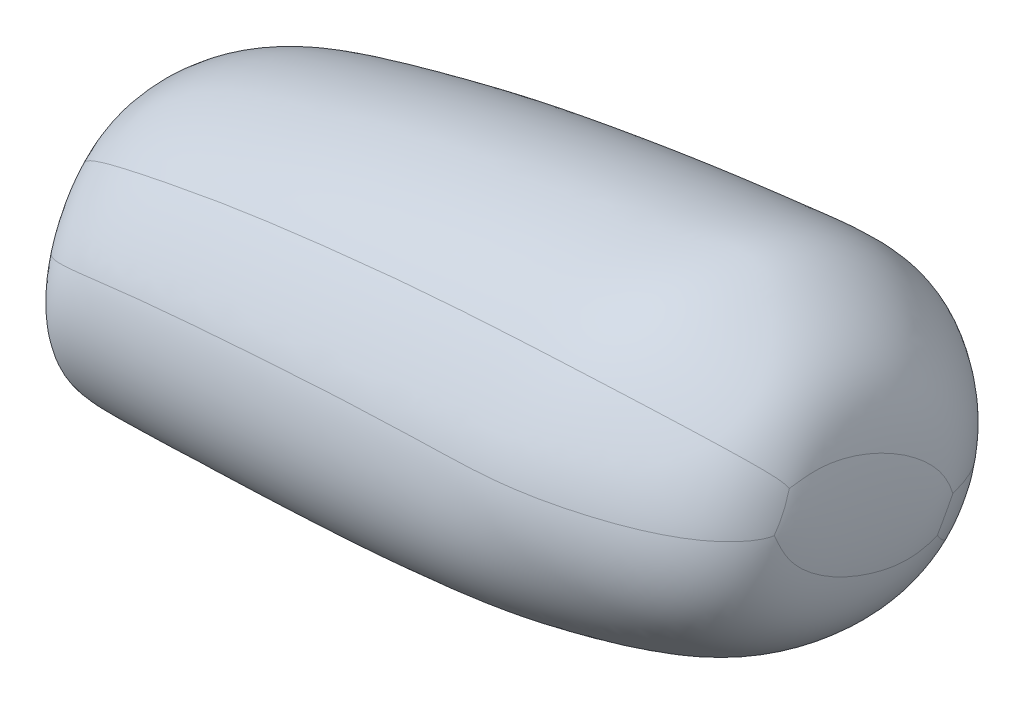
ISO-10303-21;
HEADER;
FILE_DESCRIPTION(('STEP AP214'),'2;1');
FILE_NAME('part.step','',(''),(''),'','','');
FILE_SCHEMA(('AUTOMOTIVE_DESIGN { 1 0 10303 214 1 1 1 1 }'));
ENDSEC;
DATA;
#1=APPLICATION_CONTEXT('core data for automotive mechanical design processes');
#2=APPLICATION_PROTOCOL_DEFINITION('international standard','automotive_design',2000,#1);
#3=PRODUCT_CONTEXT('',#1,'mechanical');
#4=PRODUCT('Part','Part','',(#3));
#5=PRODUCT_RELATED_PRODUCT_CATEGORY('part','',(#4));
#6=PRODUCT_DEFINITION_FORMATION('','',#4);
#7=PRODUCT_DEFINITION_CONTEXT('part definition',#1,'design');
#8=PRODUCT_DEFINITION('design','',#6,#7);
#9=PRODUCT_DEFINITION_SHAPE('','',#8);
#10=(LENGTH_UNIT() NAMED_UNIT(*) SI_UNIT(.MILLI.,.METRE.));
#11=(NAMED_UNIT(*) PLANE_ANGLE_UNIT() SI_UNIT($,.RADIAN.));
#12=(NAMED_UNIT(*) SI_UNIT($,.STERADIAN.) SOLID_ANGLE_UNIT());
#13=UNCERTAINTY_MEASURE_WITH_UNIT(LENGTH_MEASURE(1.E-05),#10,'distance_accuracy_value','');
#14=(GEOMETRIC_REPRESENTATION_CONTEXT(3) GLOBAL_UNCERTAINTY_ASSIGNED_CONTEXT((#13)) GLOBAL_UNIT_ASSIGNED_CONTEXT((#10,
#11,#12)) REPRESENTATION_CONTEXT('',''));
#15=CARTESIAN_POINT('',(0.,0.,0.));
#16=DIRECTION('',(0.,0.,1.));
#17=DIRECTION('',(1.,0.,0.));
#18=AXIS2_PLACEMENT_3D('',#15,#16,#17);
#19=CARTESIAN_POINT('',(-775.188289222874,1293.83590449192,-55.8352299023156));
#20=CARTESIAN_POINT('',(-775.262463517871,1293.85309766254,-56.1003178702829));
#21=CARTESIAN_POINT('',(-775.333742573866,1294.00756160706,-56.812022507134));
#22=CARTESIAN_POINT('',(-775.300906343271,1293.78723936042,-58.2315292721211));
#23=CARTESIAN_POINT('',(-775.135011755069,1293.20700646873,-59.6116873509583));
#24=CARTESIAN_POINT('',(-774.916260258601,1292.37881643269,-60.5468307194239));
#25=CARTESIAN_POINT('',(-774.848734656061,1291.73415921497,-60.7193931335585));
#26=CARTESIAN_POINT('',(-774.768174676021,1291.52286853457,-60.8249146062292));
#27=CARTESIAN_POINT('',(-775.191388356269,1293.54414990327,-55.6970612116697));
#28=CARTESIAN_POINT('',(-775.342836079685,1293.28678165585,-56.0890684569911));
#29=CARTESIAN_POINT('',(-775.367412414445,1293.21879886083,-56.5715676545103));
#30=CARTESIAN_POINT('',(-775.338605889292,1292.81119503687,-57.7233909400768));
#31=CARTESIAN_POINT('',(-775.208517463264,1292.28149090375,-58.9797945516244));
#32=CARTESIAN_POINT('',(-775.059953482427,1291.73282665859,-59.938259494955));
#33=CARTESIAN_POINT('',(-775.020756034919,1291.39513903376,-60.2100248632943));
#34=CARTESIAN_POINT('',(-774.813905375389,1291.24771310377,-60.6229912074435));
#35=CARTESIAN_POINT('',(-775.099239719375,1293.07147484569,-55.3336248728153));
#36=CARTESIAN_POINT('',(-775.241698240525,1292.7708717172,-55.6982540583898));
#37=CARTESIAN_POINT('',(-775.196431266564,1292.33911095246,-55.9213534521677));
#38=CARTESIAN_POINT('',(-775.162866626231,1291.55190228704,-56.8993087960725));
#39=CARTESIAN_POINT('',(-775.059712829213,1290.98262989636,-58.2310212801758));
#40=CARTESIAN_POINT('',(-774.986513053818,1290.74719752067,-59.430414206523));
#41=CARTESIAN_POINT('',(-774.983743851391,1290.80919764032,-59.9212284846397));
#42=CARTESIAN_POINT('',(-774.78453344235,1290.7062029985,-60.3638512270134));
#43=CARTESIAN_POINT('',(-774.999541022914,1292.85888732335,-55.0914542314921));
#44=CARTESIAN_POINT('',(-775.02092093525,1292.60229199793,-55.1526835036232));
#45=CARTESIAN_POINT('',(-774.924809314604,1291.87748609654,-55.2384087412682));
#46=CARTESIAN_POINT('',(-774.885014306384,1290.73392948528,-56.2327693840015));
#47=CARTESIAN_POINT('',(-774.77978822456,1290.05674717939,-57.7983659827278));
#48=CARTESIAN_POINT('',(-774.744148573454,1289.98792797866,-59.3222272817022));
#49=CARTESIAN_POINT('',(-774.763366391461,1290.31141840614,-60.0219510975417));
#50=CARTESIAN_POINT('',(-774.704018605422,1290.40868172299,-60.2834587214865));
#51=(BOUNDED_SURFACE() B_SPLINE_SURFACE(3,3,((#19,#20,#21,#22,#23,#24,#25,#26),(#27,#28,#29,#30,
#31,#32,#33,#34),(#35,#36,#37,#38,#39,#40,#41,#42),(#43,#44,#45,#46,#47,#48,#49,#50)),
.UNSPECIFIED.,.F.,.F.,.F.) B_SPLINE_SURFACE_WITH_KNOTS((4,4),(4,1,1,1,1,4),(0.,1.),(0.,1.,2.,3.,
4.,5.),.UNSPECIFIED.) GEOMETRIC_REPRESENTATION_ITEM() RATIONAL_B_SPLINE_SURFACE(((0.75,1.,1.,1.,
1.,1.,1.,0.75),(1.,1.,1.,1.,1.,1.,1.,1.),(1.,1.,1.,1.,1.,1.,1.,1.),(0.75,1.,1.,1.,1.,1.,1.,0.75))) REPRESENTATION_ITEM('') SURFACE());
#52=CARTESIAN_POINT('',(-775.188289222874,1293.83590449192,-55.8352299023156));
#53=CARTESIAN_POINT('',(-775.191388356269,1293.54414990327,-55.6970612116697));
#54=CARTESIAN_POINT('',(-775.099239719375,1293.07147484569,-55.3336248728153));
#55=CARTESIAN_POINT('',(-774.999541022914,1292.85888732335,-55.0914542314921));
#56=(BOUNDED_CURVE() B_SPLINE_CURVE(3,(#52,#53,#54,#55),.UNSPECIFIED.,.F.,
.F.) B_SPLINE_CURVE_WITH_KNOTS((4,4),(0.,1.),
.UNSPECIFIED.) CURVE() GEOMETRIC_REPRESENTATION_ITEM() RATIONAL_B_SPLINE_CURVE((0.75,1.,1.,0.75)) REPRESENTATION_ITEM(''));
#57=CARTESIAN_POINT('',(-775.188289222875,1293.83590449192,-55.8352299023155));
#58=VERTEX_POINT('',#57);
#59=CARTESIAN_POINT('',(-774.999541022915,1292.85888732335,-55.0914542314921));
#60=VERTEX_POINT('',#59);
#61=EDGE_CURVE('E74',#58,#60,#56,.T.);
#62=CARTESIAN_POINT('',(-774.768174676021,1291.52286853457,-60.8249146062292));
#63=CARTESIAN_POINT('',(-774.848734656061,1291.73415921497,-60.7193931335585));
#64=CARTESIAN_POINT('',(-774.916260258601,1292.37881643269,-60.5468307194239));
#65=CARTESIAN_POINT('',(-775.135011755069,1293.20700646873,-59.6116873509583));
#66=CARTESIAN_POINT('',(-775.300906343271,1293.78723936042,-58.2315292721211));
#67=CARTESIAN_POINT('',(-775.333742573866,1294.00756160706,-56.812022507134));
#68=CARTESIAN_POINT('',(-775.262463517871,1293.85309766254,-56.1003178702829));
#69=CARTESIAN_POINT('',(-775.188289222874,1293.83590449192,-55.8352299023156));
#70=(BOUNDED_CURVE() B_SPLINE_CURVE(3,(#62,#63,#64,#65,#66,#67,#68,#69),.UNSPECIFIED.,.F.,
.F.) B_SPLINE_CURVE_WITH_KNOTS((4,1,1,1,1,4),(0.,1.,2.,3.,4.,5.),
.UNSPECIFIED.) CURVE() GEOMETRIC_REPRESENTATION_ITEM() RATIONAL_B_SPLINE_CURVE((0.75,1.,1.,1.,
1.,1.,1.,0.75)) REPRESENTATION_ITEM(''));
#71=CARTESIAN_POINT('',(-774.768174676021,1291.52286853457,-60.8249146062292));
#72=VERTEX_POINT('',#71);
#73=EDGE_CURVE('E77',#58,#72,#70,.F.);
#74=CARTESIAN_POINT('',(-774.768174676021,1291.52286853457,-60.8249146062292));
#75=CARTESIAN_POINT('',(-774.813905375389,1291.24771310377,-60.6229912074327));
#76=CARTESIAN_POINT('',(-774.78453344235,1290.7062029985,-60.3638512270134));
#77=CARTESIAN_POINT('',(-774.704018605422,1290.40868172299,-60.2834587214865));
#78=(BOUNDED_CURVE() B_SPLINE_CURVE(3,(#74,#75,#76,#77),.UNSPECIFIED.,.F.,
.F.) B_SPLINE_CURVE_WITH_KNOTS((4,4),(0.,1.),
.UNSPECIFIED.) CURVE() GEOMETRIC_REPRESENTATION_ITEM() RATIONAL_B_SPLINE_CURVE((0.75,1.,1.,0.75)) REPRESENTATION_ITEM(''));
#79=CARTESIAN_POINT('',(-774.704018605422,1290.40868172299,-60.2834587214865));
#80=VERTEX_POINT('',#79);
#81=EDGE_CURVE('E117',#72,#80,#78,.T.);
#82=CARTESIAN_POINT('',(-774.704018605422,1290.40868172299,-60.2834587214865));
#83=CARTESIAN_POINT('',(-774.763366391461,1290.31141840614,-60.0219510975417));
#84=CARTESIAN_POINT('',(-774.744148573454,1289.98792797866,-59.3222272817022));
#85=CARTESIAN_POINT('',(-774.77978822456,1290.05674717939,-57.7983659827278));
#86=CARTESIAN_POINT('',(-774.885014306384,1290.73392948528,-56.2327693840015));
#87=CARTESIAN_POINT('',(-774.924809314604,1291.87748609654,-55.2384087412682));
#88=CARTESIAN_POINT('',(-775.02092093525,1292.60229199793,-55.1526835036232));
#89=CARTESIAN_POINT('',(-774.999541022914,1292.85888732335,-55.0914542314921));
#90=(BOUNDED_CURVE() B_SPLINE_CURVE(3,(#82,#83,#84,#85,#86,#87,#88,#89),.UNSPECIFIED.,.F.,
.F.) B_SPLINE_CURVE_WITH_KNOTS((4,1,1,1,1,4),(0.,1.,2.,3.,4.,5.),
.UNSPECIFIED.) CURVE() GEOMETRIC_REPRESENTATION_ITEM() RATIONAL_B_SPLINE_CURVE((0.75,1.,1.,1.,
1.,1.,1.,0.75)) REPRESENTATION_ITEM(''));
#91=EDGE_CURVE('E78',#80,#60,#90,.T.);
#92=ORIENTED_EDGE('',*,*,#61,.F.);
#93=ORIENTED_EDGE('',*,*,#73,.T.);
#94=ORIENTED_EDGE('',*,*,#81,.T.);
#95=ORIENTED_EDGE('',*,*,#91,.T.);
#96=EDGE_LOOP('',(#92,#93,#94,#95));
#97=FACE_BOUND('',#96,.T.);
#98=ADVANCED_FACE('F33',(#97),#51,.F.);
#99=CARTESIAN_POINT('',(-742.289007846011,1298.67483573431,-52.5505527501039));
#100=CARTESIAN_POINT('',(-742.196411113771,1298.40747947536,-52.625078341327));
#101=CARTESIAN_POINT('',(-742.033270711882,1297.56991327432,-52.8665434189466));
#102=CARTESIAN_POINT('',(-741.805341312482,1296.4767233671,-54.1688295670276));
#103=CARTESIAN_POINT('',(-741.647609895791,1295.73215285602,-55.9797246044413));
#104=CARTESIAN_POINT('',(-741.505037398314,1295.50103722275,-57.7550246769248));
#105=CARTESIAN_POINT('',(-741.504974542463,1295.78729443635,-58.6536555900809));
#106=CARTESIAN_POINT('',(-741.541565747659,1295.86901967387,-58.946274025278));
#107=CARTESIAN_POINT('',(-742.263981222109,1299.01310783804,-52.7731651472106));
#108=CARTESIAN_POINT('',(-742.053761133753,1298.8166674239,-53.144828726796));
#109=CARTESIAN_POINT('',(-741.898402593158,1298.33237693199,-53.5251904047283));
#110=CARTESIAN_POINT('',(-741.669681554869,1297.54289050653,-54.8410608790591));
#111=CARTESIAN_POINT('',(-741.489671525019,1296.83785389959,-56.4815070576554));
#112=CARTESIAN_POINT('',(-741.37225687169,1296.38629197169,-57.9669231433606));
#113=CARTESIAN_POINT('',(-741.392794940687,1296.37694799293,-58.6412133628943));
#114=CARTESIAN_POINT('',(-741.503771549365,1296.20470907091,-59.086362129267));
#115=CARTESIAN_POINT('',(-742.314824627446,1299.67644616593,-53.1454239916468));
#116=CARTESIAN_POINT('',(-742.105768859385,1299.52750830942,-53.5418885652261));
#117=CARTESIAN_POINT('',(-741.97517895942,1299.49870657713,-54.1711265403163));
#118=CARTESIAN_POINT('',(-741.74481091777,1299.04391721127,-55.6899964553746));
#119=CARTESIAN_POINT('',(-741.509752295652,1298.30031953646,-57.3137170639541));
#120=CARTESIAN_POINT('',(-741.380381103488,1297.46564351097,-58.5762166314283));
#121=CARTESIAN_POINT('',(-741.400425173721,1297.02292592137,-59.0044823149397));
#122=CARTESIAN_POINT('',(-741.511549617954,1296.7996480682,-59.4199602427838));
#123=CARTESIAN_POINT('',(-742.388065517694,1300.0330454311,-53.3099029832911));
#124=CARTESIAN_POINT('',(-742.320158078764,1300.13687613545,-53.5903747659193));
#125=CARTESIAN_POINT('',(-742.215850946336,1300.4274994381,-54.4474374515724));
#126=CARTESIAN_POINT('',(-741.98153330022,1300.17260789991,-56.2589003483241));
#127=CARTESIAN_POINT('',(-741.683428067391,1299.33009378813,-58.0276255725935));
#128=CARTESIAN_POINT('',(-741.515189507231,1298.13939828148,-59.2438032828331));
#129=CARTESIAN_POINT('',(-741.518745560801,1297.35374522974,-59.5339279617222));
#130=CARTESIAN_POINT('',(-741.553388394609,1297.09462022484,-59.6344313646871));
#131=(BOUNDED_SURFACE() B_SPLINE_SURFACE(3,3,((#99,#100,#101,#102,#103,#104,#105,#106),(#107,
#108,#109,#110,#111,#112,#113,#114),(#115,#116,#117,#118,#119,#120,#121,#122),(#123,#124,#125,
#126,#127,#128,#129,#130)),.UNSPECIFIED.,.F.,.F.,.F.) B_SPLINE_SURFACE_WITH_KNOTS((4,4),(4,1,1,
1,1,4),(0.,1.),(0.,1.,2.,3.,4.,5.),
.UNSPECIFIED.) GEOMETRIC_REPRESENTATION_ITEM() RATIONAL_B_SPLINE_SURFACE(((0.75,1.,1.,1.,1.,1.,
1.,0.75),(1.,1.,1.,1.,1.,1.,1.,1.),(1.,1.,1.,1.,1.,1.,1.,1.),(0.75,1.,1.,1.,1.,1.,1.,0.75))) REPRESENTATION_ITEM('') SURFACE());
#132=CARTESIAN_POINT('',(-742.289007846011,1298.67483573431,-52.5505527501039));
#133=CARTESIAN_POINT('',(-742.263981222109,1299.01310783804,-52.7731651472106));
#134=CARTESIAN_POINT('',(-742.314824627446,1299.67644616593,-53.1454239916468));
#135=CARTESIAN_POINT('',(-742.388065517694,1300.0330454311,-53.3099029832911));
#136=(BOUNDED_CURVE() B_SPLINE_CURVE(3,(#132,#133,#134,#135),.UNSPECIFIED.,.F.,
.F.) B_SPLINE_CURVE_WITH_KNOTS((4,4),(0.,1.),
.UNSPECIFIED.) CURVE() GEOMETRIC_REPRESENTATION_ITEM() RATIONAL_B_SPLINE_CURVE((0.75,1.,1.,0.75)) REPRESENTATION_ITEM(''));
#137=CARTESIAN_POINT('',(-742.289007846011,1298.67483573431,-52.5505527501039));
#138=VERTEX_POINT('',#137);
#139=CARTESIAN_POINT('',(-742.388065517694,1300.0330454311,-53.3099029832911));
#140=VERTEX_POINT('',#139);
#141=EDGE_CURVE('E54',#138,#140,#136,.T.);
#142=CARTESIAN_POINT('',(-741.541565747659,1295.86901967387,-58.946274025278));
#143=CARTESIAN_POINT('',(-741.504974542463,1295.78729443635,-58.6536555900809));
#144=CARTESIAN_POINT('',(-741.505037398314,1295.50103722275,-57.7550246769248));
#145=CARTESIAN_POINT('',(-741.647609895791,1295.73215285602,-55.9797246044413));
#146=CARTESIAN_POINT('',(-741.805341312482,1296.4767233671,-54.1688295670276));
#147=CARTESIAN_POINT('',(-742.033270711882,1297.56991327432,-52.8665434189466));
#148=CARTESIAN_POINT('',(-742.196411113771,1298.40747947536,-52.625078341327));
#149=CARTESIAN_POINT('',(-742.289007846011,1298.67483573431,-52.5505527501039));
#150=(BOUNDED_CURVE() B_SPLINE_CURVE(3,(#142,#143,#144,#145,#146,#147,#148,#149),.UNSPECIFIED.,
.F.,.F.) B_SPLINE_CURVE_WITH_KNOTS((4,1,1,1,1,4),(0.,1.,2.,3.,4.,5.),
.UNSPECIFIED.) CURVE() GEOMETRIC_REPRESENTATION_ITEM() RATIONAL_B_SPLINE_CURVE((0.75,1.,1.,1.,
1.,1.,1.,0.75)) REPRESENTATION_ITEM(''));
#151=CARTESIAN_POINT('',(-741.541565747659,1295.86901967387,-58.946274025278));
#152=VERTEX_POINT('',#151);
#153=EDGE_CURVE('E102',#138,#152,#150,.F.);
#154=CARTESIAN_POINT('',(-741.553388394609,1297.09462022484,-59.6344313646871));
#155=CARTESIAN_POINT('',(-741.511549617954,1296.7996480682,-59.4199602427838));
#156=CARTESIAN_POINT('',(-741.503771549365,1296.20470907091,-59.086362129267));
#157=CARTESIAN_POINT('',(-741.541565747659,1295.86901967387,-58.946274025278));
#158=(BOUNDED_CURVE() B_SPLINE_CURVE(3,(#154,#155,#156,#157),.UNSPECIFIED.,.F.,
.F.) B_SPLINE_CURVE_WITH_KNOTS((4,4),(0.,1.),
.UNSPECIFIED.) CURVE() GEOMETRIC_REPRESENTATION_ITEM() RATIONAL_B_SPLINE_CURVE((0.75,1.,1.,0.75)) REPRESENTATION_ITEM(''));
#159=CARTESIAN_POINT('',(-741.553388394609,1297.09462022484,-59.6344313646871));
#160=VERTEX_POINT('',#159);
#161=EDGE_CURVE('E93',#152,#160,#158,.F.);
#162=CARTESIAN_POINT('',(-741.553388394609,1297.09462022484,-59.6344313646871));
#163=CARTESIAN_POINT('',(-741.518745560801,1297.35374522974,-59.5339279617222));
#164=CARTESIAN_POINT('',(-741.515189507231,1298.13939828148,-59.2438032828331));
#165=CARTESIAN_POINT('',(-741.683428067391,1299.33009378813,-58.0276255725935));
#166=CARTESIAN_POINT('',(-741.98153330022,1300.17260789991,-56.2589003483241));
#167=CARTESIAN_POINT('',(-742.215850946336,1300.4274994381,-54.4474374515724));
#168=CARTESIAN_POINT('',(-742.320158078764,1300.13687613544,-53.5903747659084));
#169=CARTESIAN_POINT('',(-742.388065517694,1300.0330454311,-53.3099029832911));
#170=(BOUNDED_CURVE() B_SPLINE_CURVE(3,(#162,#163,#164,#165,#166,#167,#168,#169),.UNSPECIFIED.,
.F.,.F.) B_SPLINE_CURVE_WITH_KNOTS((4,1,1,1,1,4),(0.,1.,2.,3.,4.,5.),
.UNSPECIFIED.) CURVE() GEOMETRIC_REPRESENTATION_ITEM() RATIONAL_B_SPLINE_CURVE((0.75,1.,1.,1.,
1.,1.,1.,0.75)) REPRESENTATION_ITEM(''));
#171=EDGE_CURVE('E90',#160,#140,#170,.T.);
#172=ORIENTED_EDGE('',*,*,#141,.F.);
#173=ORIENTED_EDGE('',*,*,#153,.T.);
#174=ORIENTED_EDGE('',*,*,#161,.T.);
#175=ORIENTED_EDGE('',*,*,#171,.T.);
#176=EDGE_LOOP('',(#172,#173,#174,#175));
#177=FACE_BOUND('',#176,.T.);
#178=ADVANCED_FACE('F96',(#177),#131,.F.);
#179=CARTESIAN_POINT('',(-741.553388394609,1297.09462022484,-59.6344313646871));
#180=CARTESIAN_POINT('',(-741.511549617954,1296.7996480682,-59.4199602427838));
#181=CARTESIAN_POINT('',(-741.503771549365,1296.20470907091,-59.086362129267));
#182=CARTESIAN_POINT('',(-741.541565747659,1295.86901967387,-58.946274025278));
#183=CARTESIAN_POINT('',(-741.629870005025,1297.13046737657,-59.9494058895554));
#184=CARTESIAN_POINT('',(-741.622674062169,1296.57637021504,-59.835438170628));
#185=CARTESIAN_POINT('',(-741.614748158024,1296.03247014889,-59.5315108956397));
#186=CARTESIAN_POINT('',(-741.615951151131,1295.61505551433,-59.0988043564645));
#187=CARTESIAN_POINT('',(-742.071107399475,1296.92093115335,-61.2618512449642));
#188=CARTESIAN_POINT('',(-742.047127768834,1296.12597639196,-61.0690841984715));
#189=CARTESIAN_POINT('',(-742.038116523699,1295.35285843952,-60.6378157416187));
#190=CARTESIAN_POINT('',(-742.059624770525,1294.74192047491,-60.0401101858672));
#191=CARTESIAN_POINT('',(-744.232988728385,1296.36416094041,-63.3079258228965));
#192=CARTESIAN_POINT('',(-744.225095677253,1295.29109112365,-63.0496443371705));
#193=CARTESIAN_POINT('',(-744.236860590436,1294.24295452729,-62.4668760661743));
#194=CARTESIAN_POINT('',(-744.288988218507,1293.41775548869,-61.6607554856669));
#195=CARTESIAN_POINT('',(-747.280637008583,1295.57757007218,-64.703903722874));
#196=CARTESIAN_POINT('',(-747.527607285464,1294.33449288982,-64.4241984886061));
#197=CARTESIAN_POINT('',(-747.823155215454,1293.11301060761,-63.7605897252849));
#198=CARTESIAN_POINT('',(-748.142256371933,1292.16509362408,-62.837422654405));
#199=CARTESIAN_POINT('',(-750.731461375451,1295.23807947689,-64.9209114960335));
#200=CARTESIAN_POINT('',(-751.018386040207,1293.98280954404,-64.6864619442658));
#201=CARTESIAN_POINT('',(-751.370639423594,1292.72202301302,-64.0967131564931));
#202=CARTESIAN_POINT('',(-751.719272922628,1291.71107158431,-63.2374913560627));
#203=CARTESIAN_POINT('',(-755.315004626866,1294.74936322706,-65.1497080600783));
#204=CARTESIAN_POINT('',(-755.600332248016,1293.49515166386,-64.941398779036));
#205=CARTESIAN_POINT('',(-756.046233446711,1292.20603664267,-64.3939527716596));
#206=CARTESIAN_POINT('',(-756.497708477909,1291.15509089946,-63.5827709050094));
#207=CARTESIAN_POINT('',(-762.227533919425,1293.73556957082,-65.1934967012507));
#208=CARTESIAN_POINT('',(-762.533820914879,1292.51272607692,-64.9922660980678));
#209=CARTESIAN_POINT('',(-762.973959944875,1291.25828857206,-64.4685416063678));
#210=CARTESIAN_POINT('',(-763.400046225715,1290.25186780981,-63.6894613328752));
#211=CARTESIAN_POINT('',(-766.451285807416,1293.00211641418,-65.0854504802732));
#212=CARTESIAN_POINT('',(-766.778517891604,1291.81064024235,-64.8912971859888));
#213=CARTESIAN_POINT('',(-767.21284376661,1290.59085874786,-64.3912796598453));
#214=CARTESIAN_POINT('',(-767.613541290774,1289.62896291526,-63.6443010845849));
#215=CARTESIAN_POINT('',(-770.762239275118,1292.10477017595,-64.8467394518262));
#216=CARTESIAN_POINT('',(-770.905424886303,1290.99123788851,-64.6489121687791));
#217=CARTESIAN_POINT('',(-771.112459867845,1289.85626176136,-64.1569391270224));
#218=CARTESIAN_POINT('',(-771.288937047316,1288.98807757453,-63.4267202886571));
#219=CARTESIAN_POINT('',(-772.676361816438,1291.64724682213,-64.2439205895737));
#220=CARTESIAN_POINT('',(-772.631778831429,1290.66943400656,-64.0570091109267));
#221=CARTESIAN_POINT('',(-772.618903278952,1289.67690564993,-63.6047715999019));
#222=CARTESIAN_POINT('',(-772.605558627373,1288.91022654157,-62.9404625936473));
#223=CARTESIAN_POINT('',(-774.096267845537,1291.52889360671,-62.5653127241077));
#224=CARTESIAN_POINT('',(-774.048390910792,1290.82434047896,-62.4290206402368));
#225=CARTESIAN_POINT('',(-774.020791985015,1290.10529907008,-62.0991137412057));
#226=CARTESIAN_POINT('',(-773.992918414642,1289.53788674624,-61.6076168704602));
#227=CARTESIAN_POINT('',(-774.641883996549,1291.58673328498,-61.1323594777077));
#228=CARTESIAN_POINT('',(-774.607054715877,1291.10028717378,-61.0359575515927));
#229=CARTESIAN_POINT('',(-774.585323033309,1290.60320835669,-60.8064739693979));
#230=CARTESIAN_POINT('',(-774.564155982409,1290.20842376431,-60.4645738399154));
#231=CARTESIAN_POINT('',(-774.768174676021,1291.52286853457,-60.8249146062292));
#232=CARTESIAN_POINT('',(-774.813905375389,1291.24771310377,-60.6229912074327));
#233=CARTESIAN_POINT('',(-774.78453344235,1290.7062029985,-60.3638512270134));
#234=CARTESIAN_POINT('',(-774.704018605422,1290.40868172299,-60.2834587214865));
#235=(BOUNDED_SURFACE() B_SPLINE_SURFACE(3,3,((#179,#180,#181,#182),(#183,#184,#185,#186),(#187,
#188,#189,#190),(#191,#192,#193,#194),(#195,#196,#197,#198),(#199,#200,#201,#202),(#203,#204,
#205,#206),(#207,#208,#209,#210),(#211,#212,#213,#214),(#215,#216,#217,#218),(#219,#220,#221,
#222),(#223,#224,#225,#226),(#227,#228,#229,#230),(#231,#232,#233,#234)),.UNSPECIFIED.,.F.,.F.,
.F.) B_SPLINE_SURFACE_WITH_KNOTS((4,1,1,1,1,1,1,1,1,1,1,4),(4,4),(0.,1.,2.,3.,4.,5.,6.,7.,8.,9.,
10.,11.),(0.,1.),
.UNSPECIFIED.) GEOMETRIC_REPRESENTATION_ITEM() RATIONAL_B_SPLINE_SURFACE(((0.75,1.,1.,0.75),(1.,
1.,1.,1.),(1.,1.,1.,1.),(1.,1.,1.,1.),(1.,1.,1.,1.),(1.,1.,1.,1.),(1.,1.,1.,1.),(1.,1.,1.,1.),
(1.,1.,1.,1.),(1.,1.,1.,1.),(1.,1.,1.,1.),(1.,1.,1.,1.),(1.,1.,1.,1.),(0.75,1.,1.,0.75))) REPRESENTATION_ITEM('') SURFACE());
#236=CARTESIAN_POINT('',(-774.768174676021,1291.52286853457,-60.8249146062292));
#237=CARTESIAN_POINT('',(-774.641883996549,1291.58673328498,-61.1323594777077));
#238=CARTESIAN_POINT('',(-774.096267845537,1291.52889360671,-62.5653127241077));
#239=CARTESIAN_POINT('',(-772.676361816438,1291.64724682213,-64.2439205895737));
#240=CARTESIAN_POINT('',(-770.762239275118,1292.10477017595,-64.8467394518262));
#241=CARTESIAN_POINT('',(-766.451285807416,1293.00211641418,-65.0854504802732));
#242=CARTESIAN_POINT('',(-762.227533919425,1293.73556957082,-65.1934967012507));
#243=CARTESIAN_POINT('',(-755.315004626866,1294.74936322706,-65.1497080600783));
#244=CARTESIAN_POINT('',(-750.731461375451,1295.23807947689,-64.9209114960335));
#245=CARTESIAN_POINT('',(-747.280637008583,1295.57757007218,-64.703903722874));
#246=CARTESIAN_POINT('',(-744.232988728385,1296.36416094041,-63.3079258228965));
#247=CARTESIAN_POINT('',(-742.071107399475,1296.92093115335,-61.2618512449642));
#248=CARTESIAN_POINT('',(-741.629870005025,1297.13046737657,-59.9494058895554));
#249=CARTESIAN_POINT('',(-741.553388394609,1297.09462022484,-59.6344313646871));
#250=(BOUNDED_CURVE() B_SPLINE_CURVE(3,(#236,#237,#238,#239,#240,#241,#242,#243,#244,#245,#246,
#247,#248,#249),.UNSPECIFIED.,.F.,.F.) B_SPLINE_CURVE_WITH_KNOTS((4,1,1,1,1,1,1,1,1,1,1,4),(0.,
1.,2.,3.,4.,5.,6.,7.,8.,9.,10.,11.),
.UNSPECIFIED.) CURVE() GEOMETRIC_REPRESENTATION_ITEM() RATIONAL_B_SPLINE_CURVE((0.75,1.,1.,1.,
1.,1.,1.,1.,1.,1.,1.,1.,1.,0.75)) REPRESENTATION_ITEM(''));
#251=EDGE_CURVE('E89',#72,#160,#250,.T.);
#252=CARTESIAN_POINT('',(-741.541565747659,1295.86901967387,-58.946274025278));
#253=CARTESIAN_POINT('',(-741.615951151131,1295.61505551433,-59.0988043564645));
#254=CARTESIAN_POINT('',(-742.059624770525,1294.74192047491,-60.0401101858672));
#255=CARTESIAN_POINT('',(-744.288988218507,1293.41775548869,-61.6607554856669));
#256=CARTESIAN_POINT('',(-748.142256371933,1292.16509362408,-62.837422654405));
#257=CARTESIAN_POINT('',(-751.719272922628,1291.71107158431,-63.2374913560627));
#258=CARTESIAN_POINT('',(-756.497708477909,1291.15509089946,-63.5827709050094));
#259=CARTESIAN_POINT('',(-763.400046225715,1290.25186780981,-63.6894613328752));
#260=CARTESIAN_POINT('',(-767.613541290774,1289.62896291526,-63.6443010845849));
#261=CARTESIAN_POINT('',(-771.288937047316,1288.98807757453,-63.4267202886571));
#262=CARTESIAN_POINT('',(-772.605558627373,1288.91022654157,-62.9404625936473));
#263=CARTESIAN_POINT('',(-773.992918414642,1289.53788674624,-61.6076168704602));
#264=CARTESIAN_POINT('',(-774.564155982409,1290.20842376431,-60.4645738399154));
#265=CARTESIAN_POINT('',(-774.704018605422,1290.40868172299,-60.2834587214865));
#266=(BOUNDED_CURVE() B_SPLINE_CURVE(3,(#252,#253,#254,#255,#256,#257,#258,#259,#260,#261,#262,
#263,#264,#265),.UNSPECIFIED.,.F.,.F.) B_SPLINE_CURVE_WITH_KNOTS((4,1,1,1,1,1,1,1,1,1,1,4),(0.,
1.,2.,3.,4.,5.,6.,7.,8.,9.,10.,11.),
.UNSPECIFIED.) CURVE() GEOMETRIC_REPRESENTATION_ITEM() RATIONAL_B_SPLINE_CURVE((0.75,1.,1.,1.,
1.,1.,1.,1.,1.,1.,1.,1.,1.,0.75)) REPRESENTATION_ITEM(''));
#267=EDGE_CURVE('E91',#152,#80,#266,.T.);
#268=ORIENTED_EDGE('',*,*,#251,.T.);
#269=ORIENTED_EDGE('',*,*,#161,.F.);
#270=ORIENTED_EDGE('',*,*,#267,.T.);
#271=ORIENTED_EDGE('',*,*,#81,.F.);
#272=EDGE_LOOP('',(#268,#269,#270,#271));
#273=FACE_BOUND('',#272,.T.);
#274=ADVANCED_FACE('F155',(#273),#235,.F.);
#275=CARTESIAN_POINT('',(-741.541565747659,1295.86901967387,-58.946274025278));
#276=CARTESIAN_POINT('',(-741.504974542463,1295.78729443635,-58.6536555900809));
#277=CARTESIAN_POINT('',(-741.505037398314,1295.50103722275,-57.7550246769248));
#278=CARTESIAN_POINT('',(-741.647609895791,1295.73215285602,-55.9797246044413));
#279=CARTESIAN_POINT('',(-741.805341312482,1296.4767233671,-54.1688295670276));
#280=CARTESIAN_POINT('',(-742.033270711882,1297.56991327432,-52.8665434189466));
#281=CARTESIAN_POINT('',(-742.196411113771,1298.40747947536,-52.625078341327));
#282=CARTESIAN_POINT('',(-742.289007846011,1298.67483573431,-52.5505527501039));
#283=CARTESIAN_POINT('',(-741.615951151131,1295.61505551433,-59.0988043564645));
#284=CARTESIAN_POINT('',(-741.61715414422,1295.19764087977,-58.6660978172676));
#285=CARTESIAN_POINT('',(-741.63781792493,1294.61578247381,-57.5431262104781));
#286=CARTESIAN_POINT('',(-741.805548266555,1294.62645181248,-55.4779421512381));
#287=CARTESIAN_POINT('',(-741.941001070095,1295.41055622765,-53.4965982549853));
#288=CARTESIAN_POINT('',(-742.168138830606,1296.80744961666,-52.207896433154));
#289=CARTESIAN_POINT('',(-742.339061093789,1297.99829152685,-52.105327955858));
#290=CARTESIAN_POINT('',(-742.406631202127,1298.60391988952,-52.2534147617415));
#291=CARTESIAN_POINT('',(-742.059624770525,1294.74192047491,-60.0401101858672));
#292=CARTESIAN_POINT('',(-742.081133017369,1294.13098251028,-59.4424046301267));
#293=CARTESIAN_POINT('',(-742.185188494969,1293.23346655667,-57.914119320881));
#294=CARTESIAN_POINT('',(-742.47746329094,1293.128578912,-55.1352323510441));
#295=CARTESIAN_POINT('',(-742.633898826322,1294.14794107934,-52.5055441594687));
#296=CARTESIAN_POINT('',(-742.861164038,1296.09025427625,-50.8651807611592));
#297=CARTESIAN_POINT('',(-743.013676465095,1297.78322150382,-50.8204460908639));
#298=CARTESIAN_POINT('',(-743.086699794168,1298.64712046036,-51.0578275090615));
#299=CARTESIAN_POINT('',(-744.288988218507,1293.41775548869,-61.6607554856669));
#300=CARTESIAN_POINT('',(-744.341115846596,1292.59255645012,-60.8546349051596));
#301=CARTESIAN_POINT('',(-744.52609653258,1291.38803348848,-58.7956891251444));
#302=CARTESIAN_POINT('',(-744.973617362,1291.26205317627,-55.0475530980795));
#303=CARTESIAN_POINT('',(-745.177399680279,1292.64043801688,-51.4833192855273));
#304=CARTESIAN_POINT('',(-745.454984628245,1295.25848253683,-49.2537592379706));
#305=CARTESIAN_POINT('',(-745.61327706113,1297.53967748869,-49.1904811820678));
#306=CARTESIAN_POINT('',(-745.687083132496,1298.71109546578,-49.513945959784));
#307=CARTESIAN_POINT('',(-748.142256371933,1292.16509362408,-62.837422654405));
#308=CARTESIAN_POINT('',(-748.461357528401,1291.21717664055,-61.9142555835143));
#309=CARTESIAN_POINT('',(-749.146666294323,1289.86847327084,-59.5488048265718));
#310=CARTESIAN_POINT('',(-750.103436716887,1289.84956083415,-55.2072487287875));
#311=CARTESIAN_POINT('',(-750.394052822095,1291.46724209326,-50.9706993153595));
#312=CARTESIAN_POINT('',(-750.400639358186,1294.51982006837,-48.2869264682955));
#313=CARTESIAN_POINT('',(-750.111303891773,1297.1858639471,-48.1872200583365));
#314=CARTESIAN_POINT('',(-749.915899583026,1298.57099440409,-48.560784684322));
#315=CARTESIAN_POINT('',(-751.719272922628,1291.71107158431,-63.2374913560627));
#316=CARTESIAN_POINT('',(-752.067906421662,1290.7001201556,-62.3782695556432));
#317=CARTESIAN_POINT('',(-752.757933651005,1289.17788750277,-60.1208799294998));
#318=CARTESIAN_POINT('',(-753.564446218407,1288.95374728703,-55.5222871139986));
#319=CARTESIAN_POINT('',(-754.197117950514,1290.69851124008,-50.9762414000525));
#320=CARTESIAN_POINT('',(-754.250041514108,1294.10214185687,-48.4050823450617));
#321=CARTESIAN_POINT('',(-753.969562650452,1296.78679241404,-48.5096875753739));
#322=CARTESIAN_POINT('',(-753.757618131006,1298.1380401354,-48.9411193743029));
#323=CARTESIAN_POINT('',(-756.497708477909,1291.15509089946,-63.5827709050094));
#324=CARTESIAN_POINT('',(-756.949183509109,1290.10414515626,-62.7715890383701));
#325=CARTESIAN_POINT('',(-757.863281236497,1288.47859222584,-60.6217535865115));
#326=CARTESIAN_POINT('',(-758.850017347841,1288.03807127288,-55.9389736106639));
#327=CARTESIAN_POINT('',(-759.552544859972,1289.87733066686,-51.22281913528));
#328=CARTESIAN_POINT('',(-759.431671209252,1293.53231296594,-48.7370116667588));
#329=CARTESIAN_POINT('',(-759.071469064649,1296.19084313251,-48.9540745118828));
#330=CARTESIAN_POINT('',(-758.820719795094,1297.50615539786,-49.4133163743799));
#331=CARTESIAN_POINT('',(-763.400046225715,1290.25186780981,-63.6894613328752));
#332=CARTESIAN_POINT('',(-763.826132506556,1289.24544704758,-62.9103810593716));
#333=CARTESIAN_POINT('',(-764.650199569915,1287.72863900831,-60.8415089487357));
#334=CARTESIAN_POINT('',(-765.59054846503,1287.31511271936,-56.2947814901414));
#335=CARTESIAN_POINT('',(-766.117019727366,1289.12687384489,-51.7322184395602));
#336=CARTESIAN_POINT('',(-765.632698109969,1292.76217311067,-49.3021230819767));
#337=CARTESIAN_POINT('',(-765.300627175803,1295.31666509679,-49.4894144688463));
#338=CARTESIAN_POINT('',(-765.075117555192,1296.56279788117,-49.9382542385446));
#339=CARTESIAN_POINT('',(-767.613541290774,1289.62896291526,-63.6443010845849));
#340=CARTESIAN_POINT('',(-768.014238814929,1288.66706708265,-62.8973225093136));
#341=CARTESIAN_POINT('',(-768.74837716155,1287.25904674118,-60.909443260472));
#342=CARTESIAN_POINT('',(-769.642265489608,1286.87247400935,-56.4987411161279));
#343=CARTESIAN_POINT('',(-769.992674282845,1288.65675487027,-52.0897796154601));
#344=CARTESIAN_POINT('',(-769.144910884886,1292.27235282953,-49.7153867953922));
#345=CARTESIAN_POINT('',(-768.840971157999,1294.72280660952,-49.8729067765393));
#346=CARTESIAN_POINT('',(-768.640688946207,1295.89975293994,-50.3113401691596));
#347=CARTESIAN_POINT('',(-771.288937047316,1288.98807757453,-63.4267202886571));
#348=CARTESIAN_POINT('',(-771.465414226796,1288.11989338769,-62.6965014502917));
#349=CARTESIAN_POINT('',(-771.757252981569,1286.91710889469,-60.7595721803328));
#350=CARTESIAN_POINT('',(-772.140705327588,1286.70383417185,-56.5390925808446));
#351=CARTESIAN_POINT('',(-772.454738745094,1288.41214456231,-52.3599698109654));
#352=CARTESIAN_POINT('',(-772.038099152244,1291.78845870867,-50.0363544803295));
#353=CARTESIAN_POINT('',(-771.987654000722,1294.09871543955,-50.1703791372895));
#354=CARTESIAN_POINT('',(-771.957387922905,1295.17983296566,-50.6074619797288));
#355=CARTESIAN_POINT('',(-772.605558627373,1288.91022654157,-62.9404625936473));
#356=CARTESIAN_POINT('',(-772.592213975793,1288.1435474332,-62.2761535874036));
#357=CARTESIAN_POINT('',(-772.56458647441,1287.061887713,-60.523392584413));
#358=CARTESIAN_POINT('',(-772.60988073537,1286.8897051988,-56.8465484564085));
#359=CARTESIAN_POINT('',(-772.846187315886,1288.3961108062,-53.2621948195859));
#360=CARTESIAN_POINT('',(-772.858804185535,1291.37531060946,-51.2963055778343));
#361=CARTESIAN_POINT('',(-773.113971161072,1293.38744888131,-51.3987906444354));
#362=CARTESIAN_POINT('',(-773.249621536238,1294.32172737172,-51.7670861452094));
#363=CARTESIAN_POINT('',(-773.992918414642,1289.53788674624,-61.6076168704602));
#364=CARTESIAN_POINT('',(-773.96504484426,1288.9704744224,-61.1161199997255));
#365=CARTESIAN_POINT('',(-773.908748414331,1288.1389079448,-59.8099463148161));
#366=CARTESIAN_POINT('',(-773.907315854861,1288.00112500976,-57.1455991187174));
#367=CARTESIAN_POINT('',(-774.076772618736,1289.13872037641,-54.5611996920082));
#368=CARTESIAN_POINT('',(-774.138203235993,1291.30480703401,-53.1370766718966));
#369=CARTESIAN_POINT('',(-774.348851472594,1292.76728267922,-53.219422607358));
#370=CARTESIAN_POINT('',(-774.460036498864,1293.44304090148,-53.4829820132218));
#371=CARTESIAN_POINT('',(-774.564155982409,1290.20842376431,-60.4645738399154));
#372=CARTESIAN_POINT('',(-774.54298893153,1289.81363917195,-60.1226737104328));
#373=CARTESIAN_POINT('',(-774.501784093098,1289.22865843665,-59.2140403568814));
#374=CARTESIAN_POINT('',(-774.499863619899,1289.13086446245,-57.365710685269));
#375=CARTESIAN_POINT('',(-774.607161986546,1289.91595668352,-55.5662299719195));
#376=CARTESIAN_POINT('',(-774.653187362633,1291.41586124062,-54.5554640303795));
#377=CARTESIAN_POINT('',(-774.800143629966,1292.43371227867,-54.6071129488566));
#378=CARTESIAN_POINT('',(-774.878462414091,1292.90289512642,-54.7880543180488));
#379=CARTESIAN_POINT('',(-774.704018605422,1290.40868172299,-60.2834587214865));
#380=CARTESIAN_POINT('',(-774.763366391461,1290.31141840614,-60.0219510975417));
#381=CARTESIAN_POINT('',(-774.744148573454,1289.98792797866,-59.3222272817022));
#382=CARTESIAN_POINT('',(-774.77978822456,1290.05674717939,-57.7983659827278));
#383=CARTESIAN_POINT('',(-774.885014306384,1290.73392948528,-56.2327693840015));
#384=CARTESIAN_POINT('',(-774.924809314604,1291.87748609654,-55.2384087412682));
#385=CARTESIAN_POINT('',(-775.02092093525,1292.60229199793,-55.1526835036232));
#386=CARTESIAN_POINT('',(-774.999541022914,1292.85888732335,-55.0914542314921));
#387=(BOUNDED_SURFACE() B_SPLINE_SURFACE(3,3,((#275,#276,#277,#278,#279,#280,#281,#282),(#283,
#284,#285,#286,#287,#288,#289,#290),(#291,#292,#293,#294,#295,#296,#297,#298),(#299,#300,#301,
#302,#303,#304,#305,#306),(#307,#308,#309,#310,#311,#312,#313,#314),(#315,#316,#317,#318,#319,
#320,#321,#322),(#323,#324,#325,#326,#327,#328,#329,#330),(#331,#332,#333,#334,#335,#336,#337,
#338),(#339,#340,#341,#342,#343,#344,#345,#346),(#347,#348,#349,#350,#351,#352,#353,#354),(#355,
#356,#357,#358,#359,#360,#361,#362),(#363,#364,#365,#366,#367,#368,#369,#370),(#371,#372,#373,
#374,#375,#376,#377,#378),(#379,#380,#381,#382,#383,#384,#385,#386)),.UNSPECIFIED.,.F.,.F.,
.F.) B_SPLINE_SURFACE_WITH_KNOTS((4,1,1,1,1,1,1,1,1,1,1,4),(4,1,1,1,1,4),(0.,1.,2.,3.,4.,5.,6.,
7.,8.,9.,10.,11.),(0.,1.,2.,3.,4.,5.),
.UNSPECIFIED.) GEOMETRIC_REPRESENTATION_ITEM() RATIONAL_B_SPLINE_SURFACE(((0.75,1.,1.,1.,1.,1.,
1.,0.75),(1.,1.,1.,1.,1.,1.,1.,1.),(1.,1.,1.,1.,1.,1.,1.,1.),(1.,1.,1.,1.,1.,1.,1.,1.),(1.,1.,
1.,1.,1.,1.,1.,1.),(1.,1.,1.,1.,1.,1.,1.,1.),(1.,1.,1.,1.,1.,1.,1.,1.),(1.,1.,1.,1.,1.,1.,1.,
1.),(1.,1.,1.,1.,1.,1.,1.,1.),(1.,1.,1.,1.,1.,1.,1.,1.),(1.,1.,1.,1.,1.,1.,1.,1.),(1.,1.,1.,1.,
1.,1.,1.,1.),(1.,1.,1.,1.,1.,1.,1.,1.),(0.75,1.,1.,1.,1.,1.,1.,0.75))) REPRESENTATION_ITEM('') SURFACE());
#388=CARTESIAN_POINT('',(-774.999541022914,1292.85888732335,-55.0914542314921));
#389=CARTESIAN_POINT('',(-774.878462414091,1292.90289512642,-54.7880543180488));
#390=CARTESIAN_POINT('',(-774.460036498864,1293.44304090148,-53.4829820132218));
#391=CARTESIAN_POINT('',(-773.249621536238,1294.32172737172,-51.7670861452094));
#392=CARTESIAN_POINT('',(-771.957387922905,1295.17983296566,-50.6074619797288));
#393=CARTESIAN_POINT('',(-768.640688946207,1295.89975293994,-50.3113401691596));
#394=CARTESIAN_POINT('',(-765.075117555192,1296.56279788117,-49.9382542385446));
#395=CARTESIAN_POINT('',(-758.820719795094,1297.50615539786,-49.4133163743799));
#396=CARTESIAN_POINT('',(-753.757618131006,1298.1380401354,-48.9411193743029));
#397=CARTESIAN_POINT('',(-749.915899583026,1298.57099440409,-48.560784684322));
#398=CARTESIAN_POINT('',(-745.687083132496,1298.71109546578,-49.513945959784));
#399=CARTESIAN_POINT('',(-743.086699794168,1298.64712046036,-51.0578275090615));
#400=CARTESIAN_POINT('',(-742.406631202127,1298.60391988952,-52.2534147617415));
#401=CARTESIAN_POINT('',(-742.289007846011,1298.67483573431,-52.5505527501039));
#402=(BOUNDED_CURVE() B_SPLINE_CURVE(3,(#388,#389,#390,#391,#392,#393,#394,#395,#396,#397,#398,
#399,#400,#401),.UNSPECIFIED.,.F.,.F.) B_SPLINE_CURVE_WITH_KNOTS((4,1,1,1,1,1,1,1,1,1,1,4),(0.,
1.,2.,3.,4.,5.,6.,7.,8.,9.,10.,11.),
.UNSPECIFIED.) CURVE() GEOMETRIC_REPRESENTATION_ITEM() RATIONAL_B_SPLINE_CURVE((0.75,1.,1.,1.,
1.,1.,1.,1.,1.,1.,1.,1.,1.,0.75)) REPRESENTATION_ITEM(''));
#403=EDGE_CURVE('E46',#138,#60,#402,.F.);
#404=ORIENTED_EDGE('',*,*,#267,.F.);
#405=ORIENTED_EDGE('',*,*,#153,.F.);
#406=ORIENTED_EDGE('',*,*,#403,.T.);
#407=ORIENTED_EDGE('',*,*,#91,.F.);
#408=EDGE_LOOP('',(#404,#405,#406,#407));
#409=FACE_BOUND('',#408,.T.);
#410=ADVANCED_FACE('F115',(#409),#387,.F.);
#411=CARTESIAN_POINT('',(-774.768174676021,1291.52286853457,-60.8249146062292));
#412=CARTESIAN_POINT('',(-774.848734656061,1291.73415921497,-60.7193931335585));
#413=CARTESIAN_POINT('',(-774.916260258601,1292.37881643269,-60.5468307194239));
#414=CARTESIAN_POINT('',(-775.135011755069,1293.20700646873,-59.6116873509583));
#415=CARTESIAN_POINT('',(-775.300906343271,1293.78723936042,-58.2315292721211));
#416=CARTESIAN_POINT('',(-775.333742573866,1294.00756160706,-56.812022507134));
#417=CARTESIAN_POINT('',(-775.262463517871,1293.85309766254,-56.1003178702829));
#418=CARTESIAN_POINT('',(-775.188289222874,1293.83590449192,-55.8352299023156));
#419=CARTESIAN_POINT('',(-774.641883996549,1291.58673328498,-61.1323594777077));
#420=CARTESIAN_POINT('',(-774.676713277231,1292.07317939618,-61.2287614038227));
#421=CARTESIAN_POINT('',(-774.772567034766,1293.02480620679,-61.1554019439038));
#422=CARTESIAN_POINT('',(-775.061506046884,1294.1325220337,-60.2435801503031));
#423=CARTESIAN_POINT('',(-775.263206797241,1294.76328368398,-58.7396676041654));
#424=CARTESIAN_POINT('',(-775.300072733297,1294.79632435328,-57.0524773597468));
#425=CARTESIAN_POINT('',(-775.182090956077,1294.41941366922,-56.1115672835855));
#426=CARTESIAN_POINT('',(-775.111015794455,1294.11046590996,-55.7083106249724));
#427=CARTESIAN_POINT('',(-774.096267845537,1291.52889360671,-62.5653127241077));
#428=CARTESIAN_POINT('',(-774.144144780291,1292.23344673446,-62.7016048079786));
#429=CARTESIAN_POINT('',(-774.280454667709,1293.61357642773,-62.5869593453784));
#430=CARTESIAN_POINT('',(-774.699415331462,1295.21293167909,-61.2865678852259));
#431=CARTESIAN_POINT('',(-774.990471472478,1296.12494487892,-59.1370197247317));
#432=CARTESIAN_POINT('',(-775.052972460716,1296.16806892174,-56.7268314458993));
#433=CARTESIAN_POINT('',(-774.887866416006,1295.62892721896,-55.3878992200123));
#434=CARTESIAN_POINT('',(-774.7880669377,1295.18400248231,-54.8101932415393));
#435=CARTESIAN_POINT('',(-772.676361816438,1291.64724682213,-64.2439205895737));
#436=CARTESIAN_POINT('',(-772.720944801457,1292.6250596377,-64.4308320682207));
#437=CARTESIAN_POINT('',(-772.87352563656,1294.55125418675,-64.2740029607809));
#438=CARTESIAN_POINT('',(-773.452936182335,1296.74420726841,-62.4817756070001));
#439=CARTESIAN_POINT('',(-773.866387059757,1297.97013407059,-59.5210310868543));
#440=CARTESIAN_POINT('',(-773.98162611137,1298.04037242995,-56.2186089827598));
#441=CARTESIAN_POINT('',(-773.775679661482,1297.33411184455,-54.4102553826012));
#442=CARTESIAN_POINT('',(-773.652334417731,1296.72630277578,-53.6154927484324));
#443=CARTESIAN_POINT('',(-770.762239275118,1292.10477017595,-64.8467394518262));
#444=CARTESIAN_POINT('',(-770.619053663951,1293.2183024634,-65.0445667348733));
#445=CARTESIAN_POINT('',(-770.460381182311,1295.40247935883,-64.8519297835481));
#446=CARTESIAN_POINT('',(-770.932755743968,1297.92950592929,-62.8469239752719));
#447=CARTESIAN_POINT('',(-771.459162371282,1299.35730057138,-59.4773181166838));
#448=CARTESIAN_POINT('',(-771.852427765427,1299.46548866974,-55.7159543651436));
#449=CARTESIAN_POINT('',(-771.855144378688,1298.67193880015,-53.6778858116733));
#450=CARTESIAN_POINT('',(-771.873478321946,1297.96999798935,-52.7647919951146));
#451=CARTESIAN_POINT('',(-766.451285807416,1293.00211641418,-65.0854504802732));
#452=CARTESIAN_POINT('',(-766.124053723236,1294.19359258603,-65.2796037745467));
#453=CARTESIAN_POINT('',(-765.683777136532,1296.51993428447,-65.0561818993969));
#454=CARTESIAN_POINT('',(-766.097351683896,1299.24188538736,-62.9352488693571));
#455=CARTESIAN_POINT('',(-766.758527151149,1300.80736244728,-59.3808483330587));
#456=CARTESIAN_POINT('',(-767.377204961347,1300.84747038277,-55.4332487134676));
#457=CARTESIAN_POINT('',(-767.754546729877,1299.83851066893,-53.3750743385904));
#458=CARTESIAN_POINT('',(-767.973179452073,1299.02193785506,-52.4614773475267));
#459=CARTESIAN_POINT('',(-762.227533919425,1293.73556957082,-65.1934967012507));
#460=CARTESIAN_POINT('',(-761.92124692397,1294.95841306471,-65.3947273044227));
#461=CARTESIAN_POINT('',(-761.576377002126,1297.34091203059,-65.152200733765));
#462=CARTESIAN_POINT('',(-761.86901590468,1300.27741249847,-62.9504841491555));
#463=CARTESIAN_POINT('',(-762.634242277512,1301.98875144865,-59.2542141727887));
#464=CARTESIAN_POINT('',(-763.401343999995,1301.99945758778,-55.1410045512169));
#465=CARTESIAN_POINT('',(-763.986874924238,1300.82579907394,-53.0437759838462));
#466=CARTESIAN_POINT('',(-764.275749542357,1299.92487465762,-52.1174519190308));
#467=CARTESIAN_POINT('',(-755.315004626866,1294.74936322706,-65.1497080600783));
#468=CARTESIAN_POINT('',(-755.029677005734,1296.00357479025,-65.3580173411097));
#469=CARTESIAN_POINT('',(-754.780168918558,1298.44219100062,-65.0963624505042));
#470=CARTESIAN_POINT('',(-754.951939421579,1301.5933008679,-62.8138977479742));
#471=CARTESIAN_POINT('',(-755.821216700009,1303.45050170833,-58.9757583315498));
#472=CARTESIAN_POINT('',(-756.736583118727,1303.43175922917,-54.6969058131966));
#473=CARTESIAN_POINT('',(-757.53031143419,1302.09337744839,-52.5606104989078));
#474=CARTESIAN_POINT('',(-757.889442246472,1301.10810227949,-51.6215605191086));
#475=CARTESIAN_POINT('',(-750.731461375451,1295.23807947689,-64.9209114960335));
#476=CARTESIAN_POINT('',(-750.444536710703,1296.49334940974,-65.1553610478012));
#477=CARTESIAN_POINT('',(-750.001344818489,1298.99285607912,-64.9136616793265));
#478=CARTESIAN_POINT('',(-750.106654934359,1302.34738304589,-62.6299685422024));
#479=CARTESIAN_POINT('',(-750.942876492242,1304.36219292311,-58.7096973020399));
#480=CARTESIAN_POINT('',(-751.890688669792,1304.33663995082,-54.2972617521744));
#481=CARTESIAN_POINT('',(-752.615812488201,1302.91863210701,-52.0948693430797));
#482=CARTESIAN_POINT('',(-752.938918246344,1301.88404506398,-51.1389907494795));
#483=CARTESIAN_POINT('',(-747.280637008583,1295.57757007218,-64.703903722874));
#484=CARTESIAN_POINT('',(-747.033666731682,1296.82064725451,-64.9836089571311));
#485=CARTESIAN_POINT('',(-746.636881484081,1299.34999141943,-64.775212367593));
#486=CARTESIAN_POINT('',(-746.682139185165,1302.91608761891,-62.5088991008736));
#487=CARTESIAN_POINT('',(-747.526936993615,1305.07897020965,-58.5113350553241));
#488=CARTESIAN_POINT('',(-748.376422412453,1305.06963988345,-53.9537523061641));
#489=CARTESIAN_POINT('',(-748.944283141325,1303.57694850136,-51.6701269181502));
#490=CARTESIAN_POINT('',(-749.209318765677,1302.48515616853,-50.7007293426904));
#491=CARTESIAN_POINT('',(-744.232988728385,1296.36416094041,-63.3079258228965));
#492=CARTESIAN_POINT('',(-744.240881779526,1297.43723075715,-63.5662073086334));
#493=CARTESIAN_POINT('',(-744.295983810449,1299.63323683146,-63.4337967095016));
#494=CARTESIAN_POINT('',(-744.711884013477,1302.625641134,-61.5084398910774));
#495=CARTESIAN_POINT('',(-745.407283711394,1304.34101503352,-58.0884066515132));
#496=CARTESIAN_POINT('',(-745.778419289584,1304.25085933919,-54.200624149254));
#497=CARTESIAN_POINT('',(-745.858020467516,1302.94161337932,-52.1965733193358));
#498=CARTESIAN_POINT('',(-745.843687798847,1302.01318265022,-51.3562763201426));
#499=CARTESIAN_POINT('',(-742.071107399475,1296.92093115335,-61.2618512449642));
#500=CARTESIAN_POINT('',(-742.095087030106,1297.71588591475,-61.454618291446));
#501=CARTESIAN_POINT('',(-742.172983062382,1299.34946905544,-61.3631495636784));
#502=CARTESIAN_POINT('',(-742.51164538479,1301.55403377269,-59.9327481031714));
#503=CARTESIAN_POINT('',(-743.014886486693,1302.81400793361,-57.4055486604295));
#504=CARTESIAN_POINT('',(-743.265658148436,1302.73880445268,-54.5371197366449));
#505=CARTESIAN_POINT('',(-743.288088724402,1301.76203349455,-53.0386860924379));
#506=CARTESIAN_POINT('',(-743.258801146106,1301.07718360537,-52.415512595612));
#507=CARTESIAN_POINT('',(-741.629870005025,1297.13046737657,-59.9494058895554));
#508=CARTESIAN_POINT('',(-741.637065947872,1297.68456453811,-60.063373608472));
#509=CARTESIAN_POINT('',(-741.649997910976,1298.813153052,-59.911389934227));
#510=CARTESIAN_POINT('',(-741.85710383912,1300.35986803979,-58.7415340812437));
#511=CARTESIAN_POINT('',(-742.218255682669,1301.30129858854,-56.8278042412627));
#512=CARTESIAN_POINT('',(-742.456522933261,1301.35629229907,-54.7237483628177));
#513=CARTESIAN_POINT('',(-742.534547298135,1300.74624396148,-53.6388609665907));
#514=CARTESIAN_POINT('',(-742.529213846827,1300.28581399196,-53.1939101923182));
#515=CARTESIAN_POINT('',(-741.553388394609,1297.09462022484,-59.6344313646871));
#516=CARTESIAN_POINT('',(-741.518745560801,1297.35374522974,-59.5339279617222));
#517=CARTESIAN_POINT('',(-741.515189507231,1298.13939828148,-59.2438032828331));
#518=CARTESIAN_POINT('',(-741.683428067391,1299.33009378813,-58.0276255725935));
#519=CARTESIAN_POINT('',(-741.98153330022,1300.17260789991,-56.2589003483241));
#520=CARTESIAN_POINT('',(-742.215850946336,1300.4274994381,-54.4474374515724));
#521=CARTESIAN_POINT('',(-742.320158078764,1300.13687613544,-53.5903747659084));
#522=CARTESIAN_POINT('',(-742.388065517694,1300.0330454311,-53.3099029832911));
#523=(BOUNDED_SURFACE() B_SPLINE_SURFACE(3,3,((#411,#412,#413,#414,#415,#416,#417,#418),(#419,
#420,#421,#422,#423,#424,#425,#426),(#427,#428,#429,#430,#431,#432,#433,#434),(#435,#436,#437,
#438,#439,#440,#441,#442),(#443,#444,#445,#446,#447,#448,#449,#450),(#451,#452,#453,#454,#455,
#456,#457,#458),(#459,#460,#461,#462,#463,#464,#465,#466),(#467,#468,#469,#470,#471,#472,#473,
#474),(#475,#476,#477,#478,#479,#480,#481,#482),(#483,#484,#485,#486,#487,#488,#489,#490),(#491,
#492,#493,#494,#495,#496,#497,#498),(#499,#500,#501,#502,#503,#504,#505,#506),(#507,#508,#509,
#510,#511,#512,#513,#514),(#515,#516,#517,#518,#519,#520,#521,#522)),.UNSPECIFIED.,.F.,.F.,
.F.) B_SPLINE_SURFACE_WITH_KNOTS((4,1,1,1,1,1,1,1,1,1,1,4),(4,1,1,1,1,4),(0.,1.,2.,3.,4.,5.,6.,
7.,8.,9.,10.,11.),(0.,1.,2.,3.,4.,5.),
.UNSPECIFIED.) GEOMETRIC_REPRESENTATION_ITEM() RATIONAL_B_SPLINE_SURFACE(((0.75,1.,1.,1.,1.,1.,
1.,0.75),(1.,1.,1.,1.,1.,1.,1.,1.),(1.,1.,1.,1.,1.,1.,1.,1.),(1.,1.,1.,1.,1.,1.,1.,1.),(1.,1.,
1.,1.,1.,1.,1.,1.),(1.,1.,1.,1.,1.,1.,1.,1.),(1.,1.,1.,1.,1.,1.,1.,1.),(1.,1.,1.,1.,1.,1.,1.,
1.),(1.,1.,1.,1.,1.,1.,1.,1.),(1.,1.,1.,1.,1.,1.,1.,1.),(1.,1.,1.,1.,1.,1.,1.,1.),(1.,1.,1.,1.,
1.,1.,1.,1.),(1.,1.,1.,1.,1.,1.,1.,1.),(0.75,1.,1.,1.,1.,1.,1.,0.75))) REPRESENTATION_ITEM('') SURFACE());
#524=CARTESIAN_POINT('',(-775.188289222874,1293.83590449192,-55.8352299023156));
#525=CARTESIAN_POINT('',(-775.111015794455,1294.11046590996,-55.7083106249724));
#526=CARTESIAN_POINT('',(-774.7880669377,1295.18400248231,-54.8101932415393));
#527=CARTESIAN_POINT('',(-773.652334417731,1296.72630277578,-53.6154927484324));
#528=CARTESIAN_POINT('',(-771.873478321946,1297.96999798935,-52.7647919951146));
#529=CARTESIAN_POINT('',(-767.973179452073,1299.02193785506,-52.4614773475267));
#530=CARTESIAN_POINT('',(-764.275749542357,1299.92487465762,-52.1174519190308));
#531=CARTESIAN_POINT('',(-757.889442246472,1301.10810227949,-51.6215605191086));
#532=CARTESIAN_POINT('',(-752.938918246344,1301.88404506398,-51.1389907494795));
#533=CARTESIAN_POINT('',(-749.209318765677,1302.48515616853,-50.7007293426904));
#534=CARTESIAN_POINT('',(-745.843687798847,1302.01318265022,-51.3562763201426));
#535=CARTESIAN_POINT('',(-743.258801146106,1301.07718360537,-52.415512595612));
#536=CARTESIAN_POINT('',(-742.529213846827,1300.28581399196,-53.1939101923182));
#537=CARTESIAN_POINT('',(-742.388065517694,1300.0330454311,-53.3099029832911));
#538=(BOUNDED_CURVE() B_SPLINE_CURVE(3,(#524,#525,#526,#527,#528,#529,#530,#531,#532,#533,#534,
#535,#536,#537),.UNSPECIFIED.,.F.,.F.) B_SPLINE_CURVE_WITH_KNOTS((4,1,1,1,1,1,1,1,1,1,1,4),(0.,
1.,2.,3.,4.,5.,6.,7.,8.,9.,10.,11.),
.UNSPECIFIED.) CURVE() GEOMETRIC_REPRESENTATION_ITEM() RATIONAL_B_SPLINE_CURVE((0.75,1.,1.,1.,
1.,1.,1.,1.,1.,1.,1.,1.,1.,0.75)) REPRESENTATION_ITEM(''));
#539=EDGE_CURVE('E11',#58,#140,#538,.T.);
#540=ORIENTED_EDGE('',*,*,#251,.F.);
#541=ORIENTED_EDGE('',*,*,#73,.F.);
#542=ORIENTED_EDGE('',*,*,#539,.T.);
#543=ORIENTED_EDGE('',*,*,#171,.F.);
#544=EDGE_LOOP('',(#540,#541,#542,#543));
#545=FACE_BOUND('',#544,.T.);
#546=ADVANCED_FACE('F86',(#545),#523,.F.);
#547=CARTESIAN_POINT('',(-774.999541022914,1292.85888732335,-55.0914542314921));
#548=CARTESIAN_POINT('',(-774.878462414091,1292.90289512642,-54.7880543180488));
#549=CARTESIAN_POINT('',(-774.460036498864,1293.44304090148,-53.4829820132218));
#550=CARTESIAN_POINT('',(-773.249621536238,1294.32172737172,-51.7670861452094));
#551=CARTESIAN_POINT('',(-771.957387922905,1295.17983296566,-50.6074619797288));
#552=CARTESIAN_POINT('',(-768.640688946207,1295.89975293994,-50.3113401691596));
#553=CARTESIAN_POINT('',(-765.075117555192,1296.56279788117,-49.9382542385446));
#554=CARTESIAN_POINT('',(-758.820719795094,1297.50615539786,-49.4133163743799));
#555=CARTESIAN_POINT('',(-753.757618131006,1298.1380401354,-48.9411193743029));
#556=CARTESIAN_POINT('',(-749.915899583026,1298.57099440409,-48.560784684322));
#557=CARTESIAN_POINT('',(-745.687083132496,1298.71109546578,-49.513945959784));
#558=CARTESIAN_POINT('',(-743.086699794168,1298.64712046036,-51.0578275090615));
#559=CARTESIAN_POINT('',(-742.406631202127,1298.60391988952,-52.2534147617415));
#560=CARTESIAN_POINT('',(-742.289007846011,1298.67483573431,-52.5505527501039));
#561=CARTESIAN_POINT('',(-775.099239719384,1293.07147484569,-55.3336248728153));
#562=CARTESIAN_POINT('',(-774.956781198242,1293.37207797418,-54.9689956872299));
#563=CARTESIAN_POINT('',(-774.571221525144,1294.11879912374,-53.7465414190857));
#564=CARTESIAN_POINT('',(-773.385271911403,1295.25600586211,-52.1353816459944));
#565=CARTESIAN_POINT('',(-771.927121845089,1296.26095049177,-51.0445448221681));
#566=CARTESIAN_POINT('',(-768.440406734414,1297.07669927034,-50.7497735617907));
#567=CARTESIAN_POINT('',(-764.84960793459,1297.80893066557,-50.3870940082319));
#568=CARTESIAN_POINT('',(-758.569970525539,1298.82146766319,-49.8725582368662));
#569=CARTESIAN_POINT('',(-753.54567361155,1299.48928785678,-49.3725511732101));
#570=CARTESIAN_POINT('',(-749.720495274298,1299.95612486108,-48.9343493102966));
#571=CARTESIAN_POINT('',(-745.760889203871,1299.88251344287,-49.8374107375328));
#572=CARTESIAN_POINT('',(-743.159723123232,1299.5110194169,-51.2952089272593));
#573=CARTESIAN_POINT('',(-742.474201310454,1299.20954825219,-52.401501567636));
#574=CARTESIAN_POINT('',(-742.263981222109,1299.01310783804,-52.7731651472106));
#575=CARTESIAN_POINT('',(-775.191388356269,1293.54414990327,-55.6970612116697));
#576=CARTESIAN_POINT('',(-775.039940632852,1293.80151815069,-55.3050539663701));
#577=CARTESIAN_POINT('',(-774.688267459393,1294.73907774565,-54.2324872630664));
#578=CARTESIAN_POINT('',(-773.528989173971,1296.11849370699,-52.8207301142527));
#579=CARTESIAN_POINT('',(-771.891812265194,1297.26805717857,-51.8516981785559));
#580=CARTESIAN_POINT('',(-768.191812174278,1298.20536504117,-51.5478803564849));
#581=CARTESIAN_POINT('',(-764.564624160475,1299.0239502413,-51.1911278541936));
#582=CARTESIAN_POINT('',(-758.248573058735,1300.12282711059,-50.6825105393202));
#583=CARTESIAN_POINT('',(-753.262024004477,1300.84945802094,-50.1831121558794));
#584=CARTESIAN_POINT('',(-749.47435439002,1301.39336383569,-49.7313317672199));
#585=CARTESIAN_POINT('',(-745.82935513017,1301.08475192113,-50.5159793209494));
#586=CARTESIAN_POINT('',(-743.22951356781,1300.39233371619,-51.7923390987969));
#587=CARTESIAN_POINT('',(-742.523880395518,1299.82538402245,-52.7489594180566));
#588=CARTESIAN_POINT('',(-742.314824627446,1299.67644616593,-53.1454239916468));
#589=CARTESIAN_POINT('',(-775.188289222874,1293.83590449192,-55.8352299023156));
#590=CARTESIAN_POINT('',(-775.111015794455,1294.11046590996,-55.7083106249724));
#591=CARTESIAN_POINT('',(-774.7880669377,1295.18400248231,-54.8101932415393));
#592=CARTESIAN_POINT('',(-773.652334417731,1296.72630277578,-53.6154927484324));
#593=CARTESIAN_POINT('',(-771.873478321946,1297.96999798935,-52.7647919951146));
#594=CARTESIAN_POINT('',(-767.973179452073,1299.02193785506,-52.4614773475267));
#595=CARTESIAN_POINT('',(-764.275749542357,1299.92487465762,-52.1174519190308));
#596=CARTESIAN_POINT('',(-757.889442246472,1301.10810227949,-51.6215605191086));
#597=CARTESIAN_POINT('',(-752.938918246344,1301.88404506398,-51.1389907494795));
#598=CARTESIAN_POINT('',(-749.209318765677,1302.48515616853,-50.7007293426904));
#599=CARTESIAN_POINT('',(-745.843687798847,1302.01318265022,-51.3562763201426));
#600=CARTESIAN_POINT('',(-743.258801146106,1301.07718360537,-52.415512595612));
#601=CARTESIAN_POINT('',(-742.529213846827,1300.28581399196,-53.1939101923182));
#602=CARTESIAN_POINT('',(-742.388065517694,1300.0330454311,-53.3099029832911));
#603=(BOUNDED_SURFACE() B_SPLINE_SURFACE(3,3,((#547,#548,#549,#550,#551,#552,#553,#554,#555,
#556,#557,#558,#559,#560),(#561,#562,#563,#564,#565,#566,#567,#568,#569,#570,#571,#572,#573,
#574),(#575,#576,#577,#578,#579,#580,#581,#582,#583,#584,#585,#586,#587,#588),(#589,#590,#591,
#592,#593,#594,#595,#596,#597,#598,#599,#600,#601,#602)),.UNSPECIFIED.,.F.,.F.,
.F.) B_SPLINE_SURFACE_WITH_KNOTS((4,4),(4,1,1,1,1,1,1,1,1,1,1,4),(0.,1.),(0.,1.,2.,3.,4.,5.,6.,
7.,8.,9.,10.,11.),
.UNSPECIFIED.) GEOMETRIC_REPRESENTATION_ITEM() RATIONAL_B_SPLINE_SURFACE(((0.75,1.,1.,1.,1.,1.,
1.,1.,1.,1.,1.,1.,1.,0.75),(1.,1.,1.,1.,1.,1.,1.,1.,1.,1.,1.,1.,1.,1.),(1.,1.,1.,1.,1.,1.,1.,1.,
1.,1.,1.,1.,1.,1.),(0.75,1.,1.,1.,1.,1.,1.,1.,1.,1.,1.,1.,1.,0.75))) REPRESENTATION_ITEM('') SURFACE());
#604=ORIENTED_EDGE('',*,*,#61,.T.);
#605=ORIENTED_EDGE('',*,*,#403,.F.);
#606=ORIENTED_EDGE('',*,*,#141,.T.);
#607=ORIENTED_EDGE('',*,*,#539,.F.);
#608=EDGE_LOOP('',(#604,#605,#606,#607));
#609=FACE_BOUND('',#608,.T.);
#610=ADVANCED_FACE('F35',(#609),#603,.F.);
#611=CLOSED_SHELL('',(#98,#178,#274,#410,#546,#610));
#612=MANIFOLD_SOLID_BREP('B2',#611);
#613=ADVANCED_BREP_SHAPE_REPRESENTATION('',(#18,#612),#14);
#614=SHAPE_DEFINITION_REPRESENTATION(#9,#613);
ENDSEC;
END-ISO-10303-21;
